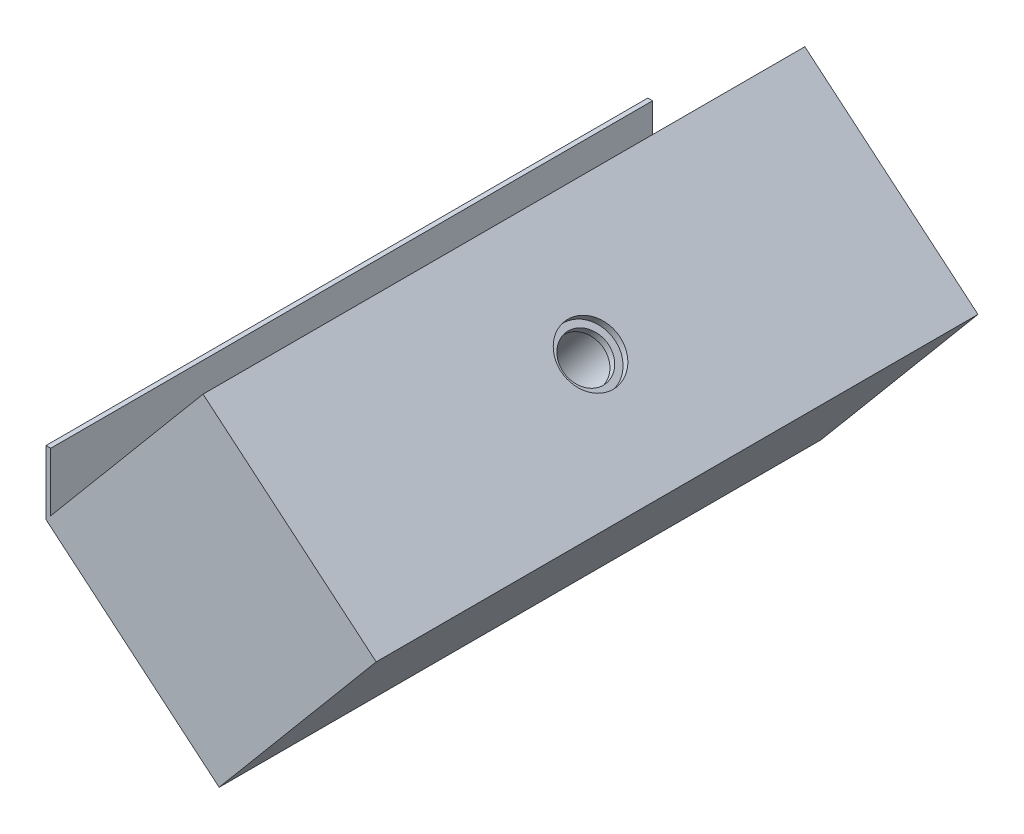
ISO-10303-21;
HEADER;
FILE_DESCRIPTION(('STEP AP214'),'2;1');
FILE_NAME('part.step','',(''),(''),'','','');
FILE_SCHEMA(('AUTOMOTIVE_DESIGN { 1 0 10303 214 1 1 1 1 }'));
ENDSEC;
DATA;
#1=APPLICATION_CONTEXT('core data for automotive mechanical design processes');
#2=APPLICATION_PROTOCOL_DEFINITION('international standard','automotive_design',2000,#1);
#3=PRODUCT_CONTEXT('',#1,'mechanical');
#4=PRODUCT('Part','Part','',(#3));
#5=PRODUCT_RELATED_PRODUCT_CATEGORY('part','',(#4));
#6=PRODUCT_DEFINITION_FORMATION('','',#4);
#7=PRODUCT_DEFINITION_CONTEXT('part definition',#1,'design');
#8=PRODUCT_DEFINITION('design','',#6,#7);
#9=PRODUCT_DEFINITION_SHAPE('','',#8);
#10=(LENGTH_UNIT() NAMED_UNIT(*) SI_UNIT(.MILLI.,.METRE.));
#11=(NAMED_UNIT(*) PLANE_ANGLE_UNIT() SI_UNIT($,.RADIAN.));
#12=(NAMED_UNIT(*) SI_UNIT($,.STERADIAN.) SOLID_ANGLE_UNIT());
#13=UNCERTAINTY_MEASURE_WITH_UNIT(LENGTH_MEASURE(1.E-05),#10,'distance_accuracy_value','');
#14=(GEOMETRIC_REPRESENTATION_CONTEXT(3) GLOBAL_UNCERTAINTY_ASSIGNED_CONTEXT((#13)) GLOBAL_UNIT_ASSIGNED_CONTEXT((#10,
#11,#12)) REPRESENTATION_CONTEXT('',''));
#15=CARTESIAN_POINT('',(0.,0.,0.));
#16=DIRECTION('',(0.,0.,1.));
#17=DIRECTION('',(1.,0.,0.));
#18=AXIS2_PLACEMENT_3D('',#15,#16,#17);
#19=CARTESIAN_POINT('',(0.,0.,262.8));
#20=DIRECTION('',(0.64278760968654,0.766044443118977,0.));
#21=DIRECTION('',(-0.766044443118977,0.64278760968654,0.));
#22=AXIS2_PLACEMENT_3D('',#19,#20,#21);
#23=PLANE('',#22);
#24=DIRECTION('',(0.,0.,-1.));
#25=VECTOR('',#24,1.);
#26=CARTESIAN_POINT('',(0.,0.,262.8));
#27=LINE('',#26,#25);
#28=CARTESIAN_POINT('',(0.,0.,537.8));
#29=VERTEX_POINT('',#28);
#30=CARTESIAN_POINT('',(0.,0.,-275.));
#31=VERTEX_POINT('',#30);
#32=EDGE_CURVE('E11',#29,#31,#27,.T.);
#33=ORIENTED_EDGE('',*,*,#32,.T.);
#34=DIRECTION('',(-0.766044443118977,0.64278760968654,0.));
#35=VECTOR('',#34,1.);
#36=CARTESIAN_POINT('',(233.858047595361,-196.230201485106,-275.));
#37=LINE('',#36,#35);
#38=CARTESIAN_POINT('',(233.858047595361,-196.230201485106,-275.));
#39=VERTEX_POINT('',#38);
#40=EDGE_CURVE('E151',#39,#31,#37,.T.);
#41=ORIENTED_EDGE('',*,*,#40,.F.);
#42=DIRECTION('',(0.,0.,-1.));
#43=VECTOR('',#42,1.);
#44=CARTESIAN_POINT('',(233.858047595361,-196.230201485106,262.8));
#45=LINE('',#44,#43);
#46=CARTESIAN_POINT('',(233.858047595361,-196.230201485106,537.8));
#47=VERTEX_POINT('',#46);
#48=EDGE_CURVE('E49',#47,#39,#45,.T.);
#49=ORIENTED_EDGE('',*,*,#48,.F.);
#50=DIRECTION('',(0.766044443118977,-0.64278760968654,0.));
#51=VECTOR('',#50,1.);
#52=CARTESIAN_POINT('',(233.858047595361,-196.230201485106,537.8));
#53=LINE('',#52,#51);
#54=EDGE_CURVE('E105',#29,#47,#53,.T.);
#55=ORIENTED_EDGE('',*,*,#54,.F.);
#56=EDGE_LOOP('',(#33,#41,#49,#55));
#57=FACE_BOUND('',#56,.T.);
#58=CARTESIAN_POINT('',(116.92902379768,-98.1151007425531,131.4));
#59=DIRECTION('',(0.64278760968654,0.766044443118977,0.));
#60=DIRECTION('',(-0.766044443118977,0.64278760968654,0.));
#61=AXIS2_PLACEMENT_3D('',#58,#59,#60);
#62=CIRCLE('',#61,36.);
#63=CARTESIAN_POINT('',(89.3514238453971,-74.9747467938377,131.4));
#64=VERTEX_POINT('',#63);
#65=EDGE_CURVE('E187',#64,#64,#62,.T.);
#66=ORIENTED_EDGE('',*,*,#65,.T.);
#67=EDGE_LOOP('',(#66));
#68=FACE_BOUND('',#67,.T.);
#69=CARTESIAN_POINT('',(189.601778735524,-159.094782607535,131.291749378634));
#70=DIRECTION('',(-0.642787609686541,-0.766044443118977,0.));
#71=DIRECTION('',(0.766044443118977,-0.64278760968654,0.));
#72=AXIS2_PLACEMENT_3D('',#69,#70,#71);
#73=CIRCLE('',#72,20.52);
#74=CARTESIAN_POINT('',(205.321010708326,-172.284784358303,131.291749378634));
#75=VERTEX_POINT('',#74);
#76=EDGE_CURVE('E354',#75,#75,#73,.F.);
#77=ORIENTED_EDGE('',*,*,#76,.T.);
#78=EDGE_LOOP('',(#77));
#79=FACE_BOUND('',#78,.T.);
#80=CARTESIAN_POINT('',(44.1240820011909,-37.0245009332355,131.291749378634));
#81=DIRECTION('',(-0.642787609686541,-0.766044443118977,0.));
#82=DIRECTION('',(0.766044443118977,-0.64278760968654,0.));
#83=AXIS2_PLACEMENT_3D('',#80,#81,#82);
#84=CIRCLE('',#83,20.52);
#85=CARTESIAN_POINT('',(59.8433139739923,-50.2145026840033,131.291749378634));
#86=VERTEX_POINT('',#85);
#87=EDGE_CURVE('E342',#86,#86,#84,.T.);
#88=ORIENTED_EDGE('',*,*,#87,.F.);
#89=EDGE_LOOP('',(#88));
#90=FACE_BOUND('',#89,.T.);
#91=ADVANCED_FACE('F40',(#57,#68,#79,#90),#23,.F.);
#92=CARTESIAN_POINT('',(205.692035099693,245.134221798073,0.));
#93=DIRECTION('',(-0.64278760968654,-0.766044443118977,0.));
#94=DIRECTION('',(0.766044443118977,-0.64278760968654,0.));
#95=AXIS2_PLACEMENT_3D('',#92,#93,#94);
#96=PLANE('',#95);
#97=CARTESIAN_POINT('',(322.621058897373,147.01912105552,131.4));
#98=DIRECTION('',(0.64278760968654,0.766044443118977,0.));
#99=DIRECTION('',(-0.766044443118977,0.64278760968654,0.));
#100=AXIS2_PLACEMENT_3D('',#97,#98,#99);
#101=CIRCLE('',#100,31.);
#102=CARTESIAN_POINT('',(298.873681160685,166.945536955802,131.4));
#103=VERTEX_POINT('',#102);
#104=EDGE_CURVE('E140',#103,#103,#101,.T.);
#105=ORIENTED_EDGE('',*,*,#104,.F.);
#106=EDGE_LOOP('',(#105));
#107=FACE_BOUND('',#106,.T.);
#108=CARTESIAN_POINT('',(322.621058897373,147.01912105552,131.4));
#109=DIRECTION('',(0.64278760968654,0.766044443118977,0.));
#110=DIRECTION('',(-0.766044443118977,0.642787609686541,0.));
#111=AXIS2_PLACEMENT_3D('',#108,#109,#110);
#112=CIRCLE('',#111,40.);
#113=CARTESIAN_POINT('',(353.262836622132,121.307616668058,131.4));
#114=VERTEX_POINT('',#113);
#115=EDGE_CURVE('E131',#114,#114,#112,.T.);
#116=ORIENTED_EDGE('',*,*,#115,.T.);
#117=EDGE_LOOP('',(#116));
#118=FACE_BOUND('',#117,.T.);
#119=ADVANCED_FACE('F223',(#107,#118),#96,.F.);
#120=CARTESIAN_POINT('',(0.,0.,262.8));
#121=DIRECTION('',(-1.,0.,0.));
#122=DIRECTION('',(0.,0.,1.));
#123=AXIS2_PLACEMENT_3D('',#120,#121,#122);
#124=PLANE('',#123);
#125=DIRECTION('',(0.,0.,-1.));
#126=VECTOR('',#125,1.);
#127=CARTESIAN_POINT('',(0.,86.6680714764509,262.8));
#128=LINE('',#127,#126);
#129=CARTESIAN_POINT('',(0.,86.6680714764509,537.8));
#130=VERTEX_POINT('',#129);
#131=CARTESIAN_POINT('',(0.,86.6680714764509,-275.));
#132=VERTEX_POINT('',#131);
#133=EDGE_CURVE('E191',#130,#132,#128,.T.);
#134=ORIENTED_EDGE('',*,*,#133,.T.);
#135=DIRECTION('',(0.,1.,0.));
#136=VECTOR('',#135,1.);
#137=CARTESIAN_POINT('',(0.,0.,-275.));
#138=LINE('',#137,#136);
#139=EDGE_CURVE('E155',#31,#132,#138,.T.);
#140=ORIENTED_EDGE('',*,*,#139,.F.);
#141=ORIENTED_EDGE('',*,*,#32,.F.);
#142=DIRECTION('',(0.,-1.,0.));
#143=VECTOR('',#142,1.);
#144=CARTESIAN_POINT('',(0.,0.,537.8));
#145=LINE('',#144,#143);
#146=EDGE_CURVE('E182',#130,#29,#145,.T.);
#147=ORIENTED_EDGE('',*,*,#146,.F.);
#148=EDGE_LOOP('',(#134,#140,#141,#147));
#149=FACE_BOUND('',#148,.T.);
#150=ADVANCED_FACE('F42',(#149),#124,.T.);
#151=CARTESIAN_POINT('',(233.858047595361,-196.230201485106,262.8));
#152=DIRECTION('',(0.766044443118977,-0.64278760968654,0.));
#153=DIRECTION('',(0.64278760968654,0.766044443118977,0.));
#154=AXIS2_PLACEMENT_3D('',#151,#152,#153);
#155=PLANE('',#154);
#156=ORIENTED_EDGE('',*,*,#48,.T.);
#157=DIRECTION('',(-0.64278760968654,-0.766044443118977,0.));
#158=VECTOR('',#157,1.);
#159=CARTESIAN_POINT('',(433.122206598188,41.2435758817765,-275.));
#160=LINE('',#159,#158);
#161=CARTESIAN_POINT('',(445.977958791919,56.5644647441563,-275.));
#162=VERTEX_POINT('',#161);
#163=EDGE_CURVE('E109',#162,#39,#160,.T.);
#164=ORIENTED_EDGE('',*,*,#163,.F.);
#165=DIRECTION('',(0.,0.,-1.));
#166=VECTOR('',#165,1.);
#167=CARTESIAN_POINT('',(445.977958791919,56.5644647441563,-275.));
#168=LINE('',#167,#166);
#169=CARTESIAN_POINT('',(445.977958791919,56.5644647441563,537.8));
#170=VERTEX_POINT('',#169);
#171=EDGE_CURVE('E112',#170,#162,#168,.T.);
#172=ORIENTED_EDGE('',*,*,#171,.F.);
#173=DIRECTION('',(0.64278760968654,0.766044443118977,0.));
#174=VECTOR('',#173,1.);
#175=CARTESIAN_POINT('',(433.122206598188,41.2435758817765,537.8));
#176=LINE('',#175,#174);
#177=EDGE_CURVE('E99',#47,#170,#176,.T.);
#178=ORIENTED_EDGE('',*,*,#177,.F.);
#179=EDGE_LOOP('',(#156,#164,#172,#178));
#180=FACE_BOUND('',#179,.T.);
#181=ADVANCED_FACE('F113',(#180),#155,.T.);
#182=CARTESIAN_POINT('',(0.,0.,262.8));
#183=DIRECTION('',(-0.766044443118979,0.642787609686538,0.));
#184=DIRECTION('',(-0.642787609686538,-0.766044443118979,0.));
#185=AXIS2_PLACEMENT_3D('',#182,#183,#184);
#186=PLANE('',#185);
#187=DIRECTION('',(-0.642787609686538,-0.766044443118979,0.));
#188=VECTOR('',#187,1.);
#189=CARTESIAN_POINT('',(6.39354625645953,7.61953172055291,537.8));
#190=LINE('',#189,#188);
#191=CARTESIAN_POINT('',(212.119911196558,252.794666229263,537.8));
#192=VERTEX_POINT('',#191);
#193=CARTESIAN_POINT('',(6.39354625645953,7.61953172055291,537.8));
#194=VERTEX_POINT('',#193);
#195=EDGE_CURVE('E108',#192,#194,#190,.T.);
#196=ORIENTED_EDGE('',*,*,#195,.F.);
#197=DIRECTION('',(0.,0.,1.));
#198=VECTOR('',#197,1.);
#199=CARTESIAN_POINT('',(212.119911196558,252.794666229263,537.8));
#200=LINE('',#199,#198);
#201=CARTESIAN_POINT('',(212.119911196558,252.794666229263,-275.));
#202=VERTEX_POINT('',#201);
#203=EDGE_CURVE('E125',#202,#192,#200,.T.);
#204=ORIENTED_EDGE('',*,*,#203,.F.);
#205=DIRECTION('',(0.642787609686538,0.766044443118979,0.));
#206=VECTOR('',#205,1.);
#207=CARTESIAN_POINT('',(6.39354625645953,7.61953172055291,-275.));
#208=LINE('',#207,#206);
#209=CARTESIAN_POINT('',(6.39354625645953,7.61953172055291,-275.));
#210=VERTEX_POINT('',#209);
#211=EDGE_CURVE('E167',#210,#202,#208,.T.);
#212=ORIENTED_EDGE('',*,*,#211,.F.);
#213=DIRECTION('',(0.,0.,-1.));
#214=VECTOR('',#213,1.);
#215=CARTESIAN_POINT('',(6.39354625645953,7.61953172055291,262.8));
#216=LINE('',#215,#214);
#217=EDGE_CURVE('E197',#194,#210,#216,.T.);
#218=ORIENTED_EDGE('',*,*,#217,.F.);
#219=EDGE_LOOP('',(#196,#204,#212,#218));
#220=FACE_BOUND('',#219,.T.);
#221=ADVANCED_FACE('F212',(#220),#186,.T.);
#222=CARTESIAN_POINT('',(6.39354625645953,0.,262.8));
#223=DIRECTION('',(1.,0.,0.));
#224=DIRECTION('',(0.,1.,0.));
#225=AXIS2_PLACEMENT_3D('',#222,#223,#224);
#226=PLANE('',#225);
#227=ORIENTED_EDGE('',*,*,#217,.T.);
#228=DIRECTION('',(0.,-1.,0.));
#229=VECTOR('',#228,1.);
#230=CARTESIAN_POINT('',(6.39354625645954,86.6680714764509,-275.));
#231=LINE('',#230,#229);
#232=CARTESIAN_POINT('',(6.39354625645954,86.6680714764509,-275.));
#233=VERTEX_POINT('',#232);
#234=EDGE_CURVE('E163',#233,#210,#231,.T.);
#235=ORIENTED_EDGE('',*,*,#234,.F.);
#236=DIRECTION('',(0.,0.,-1.));
#237=VECTOR('',#236,1.);
#238=CARTESIAN_POINT('',(6.39354625645954,86.6680714764509,262.8));
#239=LINE('',#238,#237);
#240=CARTESIAN_POINT('',(6.39354625645954,86.6680714764509,537.8));
#241=VERTEX_POINT('',#240);
#242=EDGE_CURVE('E194',#241,#233,#239,.T.);
#243=ORIENTED_EDGE('',*,*,#242,.F.);
#244=DIRECTION('',(0.,1.,0.));
#245=VECTOR('',#244,1.);
#246=CARTESIAN_POINT('',(6.39354625645954,86.6680714764509,537.8));
#247=LINE('',#246,#245);
#248=EDGE_CURVE('E174',#194,#241,#247,.T.);
#249=ORIENTED_EDGE('',*,*,#248,.F.);
#250=EDGE_LOOP('',(#227,#235,#243,#249));
#251=FACE_BOUND('',#250,.T.);
#252=ADVANCED_FACE('F210',(#251),#226,.T.);
#253=CARTESIAN_POINT('',(0.,86.6680714764509,262.8));
#254=DIRECTION('',(0.,1.,0.));
#255=DIRECTION('',(0.,0.,1.));
#256=AXIS2_PLACEMENT_3D('',#253,#254,#255);
#257=PLANE('',#256);
#258=ORIENTED_EDGE('',*,*,#242,.T.);
#259=DIRECTION('',(1.,0.,0.));
#260=VECTOR('',#259,1.);
#261=CARTESIAN_POINT('',(0.,86.6680714764509,-275.));
#262=LINE('',#261,#260);
#263=EDGE_CURVE('E159',#132,#233,#262,.T.);
#264=ORIENTED_EDGE('',*,*,#263,.F.);
#265=ORIENTED_EDGE('',*,*,#133,.F.);
#266=DIRECTION('',(-1.,0.,0.));
#267=VECTOR('',#266,1.);
#268=CARTESIAN_POINT('',(0.,86.6680714764509,537.8));
#269=LINE('',#268,#267);
#270=EDGE_CURVE('E178',#241,#130,#269,.T.);
#271=ORIENTED_EDGE('',*,*,#270,.F.);
#272=EDGE_LOOP('',(#258,#264,#265,#271));
#273=FACE_BOUND('',#272,.T.);
#274=ADVANCED_FACE('F206',(#273),#257,.T.);
#275=CARTESIAN_POINT('',(412.817694699348,254.511285812435,131.4));
#276=DIRECTION('',(-0.642787609686541,-0.766044443118977,0.));
#277=DIRECTION('',(0.766044443118977,-0.642787609686541,0.));
#278=AXIS2_PLACEMENT_3D('',#275,#276,#277);
#279=CYLINDRICAL_SURFACE('',#278,36.);
#280=CARTESIAN_POINT('',(316.193182800508,139.35867662433,131.4));
#281=DIRECTION('',(-0.64278760968654,-0.766044443118977,0.));
#282=DIRECTION('',(0.766044443118977,-0.64278760968654,0.));
#283=AXIS2_PLACEMENT_3D('',#280,#281,#282);
#284=CIRCLE('',#283,36.);
#285=CARTESIAN_POINT('',(343.770782752791,116.218322675614,131.4));
#286=VERTEX_POINT('',#285);
#287=EDGE_CURVE('E144',#286,#286,#284,.F.);
#288=ORIENTED_EDGE('',*,*,#287,.T.);
#289=EDGE_LOOP('',(#288));
#290=FACE_BOUND('',#289,.T.);
#291=ORIENTED_EDGE('',*,*,#65,.F.);
#292=EDGE_LOOP('',(#291));
#293=FACE_BOUND('',#292,.T.);
#294=ADVANCED_FACE('F249',(#290,#293),#279,.F.);
#295=CARTESIAN_POINT('',(0.,0.,537.8));
#296=DIRECTION('',(0.,0.,-1.));
#297=DIRECTION('',(-1.,0.,0.));
#298=AXIS2_PLACEMENT_3D('',#295,#296,#297);
#299=PLANE('',#298);
#300=ORIENTED_EDGE('',*,*,#177,.T.);
#301=DIRECTION('',(0.766044443118977,-0.64278760968654,0.));
#302=VECTOR('',#301,1.);
#303=CARTESIAN_POINT('',(445.977958791919,56.5644647441563,537.8));
#304=LINE('',#303,#302);
#305=EDGE_CURVE('E104',#192,#170,#304,.T.);
#306=ORIENTED_EDGE('',*,*,#305,.F.);
#307=ORIENTED_EDGE('',*,*,#195,.T.);
#308=ORIENTED_EDGE('',*,*,#248,.T.);
#309=ORIENTED_EDGE('',*,*,#270,.T.);
#310=ORIENTED_EDGE('',*,*,#146,.T.);
#311=ORIENTED_EDGE('',*,*,#54,.T.);
#312=EDGE_LOOP('',(#300,#306,#307,#308,#309,#310,#311));
#313=FACE_BOUND('',#312,.T.);
#314=ADVANCED_FACE('F101',(#313),#299,.F.);
#315=CARTESIAN_POINT('',(0.,0.,-275.));
#316=DIRECTION('',(0.,0.,-1.));
#317=DIRECTION('',(-1.,0.,0.));
#318=AXIS2_PLACEMENT_3D('',#315,#316,#317);
#319=PLANE('',#318);
#320=ORIENTED_EDGE('',*,*,#40,.T.);
#321=ORIENTED_EDGE('',*,*,#139,.T.);
#322=ORIENTED_EDGE('',*,*,#263,.T.);
#323=ORIENTED_EDGE('',*,*,#234,.T.);
#324=ORIENTED_EDGE('',*,*,#211,.T.);
#325=DIRECTION('',(-0.766044443118977,0.64278760968654,0.));
#326=VECTOR('',#325,1.);
#327=CARTESIAN_POINT('',(212.119911196558,252.794666229263,-275.));
#328=LINE('',#327,#326);
#329=EDGE_CURVE('E119',#162,#202,#328,.T.);
#330=ORIENTED_EDGE('',*,*,#329,.F.);
#331=ORIENTED_EDGE('',*,*,#163,.T.);
#332=EDGE_LOOP('',(#320,#321,#322,#323,#324,#330,#331));
#333=FACE_BOUND('',#332,.T.);
#334=ADVANCED_FACE('F201',(#333),#319,.T.);
#335=CARTESIAN_POINT('',(199.264159002828,237.473777366883,0.));
#336=DIRECTION('',(-0.64278760968654,-0.766044443118977,0.));
#337=DIRECTION('',(0.766044443118977,-0.64278760968654,0.));
#338=AXIS2_PLACEMENT_3D('',#335,#336,#337);
#339=PLANE('',#338);
#340=CARTESIAN_POINT('',(316.193182800508,139.35867662433,131.4));
#341=DIRECTION('',(0.64278760968654,0.766044443118977,0.));
#342=DIRECTION('',(-0.766044443118977,0.64278760968654,0.));
#343=AXIS2_PLACEMENT_3D('',#340,#341,#342);
#344=CIRCLE('',#343,31.);
#345=CARTESIAN_POINT('',(292.44580506382,159.285092524612,131.4));
#346=VERTEX_POINT('',#345);
#347=EDGE_CURVE('E139',#346,#346,#344,.T.);
#348=ORIENTED_EDGE('',*,*,#347,.T.);
#349=EDGE_LOOP('',(#348));
#350=FACE_BOUND('',#349,.T.);
#351=ORIENTED_EDGE('',*,*,#287,.F.);
#352=EDGE_LOOP('',(#351));
#353=FACE_BOUND('',#352,.T.);
#354=ADVANCED_FACE('F241',(#350,#353),#339,.T.);
#355=CARTESIAN_POINT('',(322.621058897373,147.01912105552,131.4));
#356=DIRECTION('',(-0.64278760968654,-0.766044443118977,0.));
#357=DIRECTION('',(0.766044443118977,-0.64278760968654,0.));
#358=AXIS2_PLACEMENT_3D('',#355,#356,#357);
#359=CYLINDRICAL_SURFACE('',#358,31.);
#360=ORIENTED_EDGE('',*,*,#104,.T.);
#361=EDGE_LOOP('',(#360));
#362=FACE_BOUND('',#361,.T.);
#363=ORIENTED_EDGE('',*,*,#347,.F.);
#364=EDGE_LOOP('',(#363));
#365=FACE_BOUND('',#364,.T.);
#366=ADVANCED_FACE('F239',(#362,#365),#359,.F.);
#367=CARTESIAN_POINT('',(212.119911196559,252.794666229263,0.));
#368=DIRECTION('',(-0.64278760968654,-0.766044443118977,0.));
#369=DIRECTION('',(0.766044443118977,-0.64278760968654,0.));
#370=AXIS2_PLACEMENT_3D('',#367,#368,#369);
#371=PLANE('',#370);
#372=ORIENTED_EDGE('',*,*,#305,.T.);
#373=ORIENTED_EDGE('',*,*,#171,.T.);
#374=ORIENTED_EDGE('',*,*,#329,.T.);
#375=ORIENTED_EDGE('',*,*,#203,.T.);
#376=EDGE_LOOP('',(#372,#373,#374,#375));
#377=FACE_BOUND('',#376,.T.);
#378=CARTESIAN_POINT('',(329.048934994239,154.679565486709,131.4));
#379=DIRECTION('',(0.64278760968654,0.766044443118977,0.));
#380=DIRECTION('',(-0.766044443118977,0.642787609686541,0.));
#381=AXIS2_PLACEMENT_3D('',#378,#379,#380);
#382=CIRCLE('',#381,40.);
#383=CARTESIAN_POINT('',(359.690712718998,128.968061099248,131.4));
#384=VERTEX_POINT('',#383);
#385=EDGE_CURVE('E127',#384,#384,#382,.T.);
#386=ORIENTED_EDGE('',*,*,#385,.F.);
#387=EDGE_LOOP('',(#386));
#388=FACE_BOUND('',#387,.T.);
#389=ADVANCED_FACE('F122',(#377,#388),#371,.F.);
#390=CARTESIAN_POINT('',(329.048934994239,154.679565486709,131.4));
#391=DIRECTION('',(-0.64278760968654,-0.766044443118977,0.));
#392=DIRECTION('',(0.766044443118977,-0.642787609686541,0.));
#393=AXIS2_PLACEMENT_3D('',#390,#391,#392);
#394=CYLINDRICAL_SURFACE('',#393,40.);
#395=CARTESIAN_POINT('',(359.690712718998,128.968061099248,131.4));
#396=CARTESIAN_POINT('',(359.623755676322,128.88826480309,131.4));
#397=CARTESIAN_POINT('',(359.556798633647,128.808468506931,131.4));
#398=CARTESIAN_POINT('',(359.422884548295,128.648875914615,131.4));
#399=CARTESIAN_POINT('',(359.355927505619,128.569079618457,131.4));
#400=CARTESIAN_POINT('',(359.222013420268,128.40948702614,131.4));
#401=CARTESIAN_POINT('',(359.155056377592,128.329690729982,131.4));
#402=CARTESIAN_POINT('',(359.021142292241,128.170098137666,131.4));
#403=CARTESIAN_POINT('',(358.954185249565,128.090301841507,131.4));
#404=CARTESIAN_POINT('',(358.820271164214,127.930709249191,131.4));
#405=CARTESIAN_POINT('',(358.753314121538,127.850912953033,131.4));
#406=CARTESIAN_POINT('',(358.619400036187,127.691320360716,131.4));
#407=CARTESIAN_POINT('',(358.552442993511,127.611524064558,131.4));
#408=CARTESIAN_POINT('',(358.41852890816,127.451931472242,131.4));
#409=CARTESIAN_POINT('',(358.351571865484,127.372135176083,131.4));
#410=CARTESIAN_POINT('',(358.217657780133,127.212542583767,131.4));
#411=CARTESIAN_POINT('',(358.150700737457,127.132746287609,131.4));
#412=CARTESIAN_POINT('',(358.016786652106,126.973153695292,131.4));
#413=CARTESIAN_POINT('',(357.94982960943,126.893357399134,131.4));
#414=CARTESIAN_POINT('',(357.815915524079,126.733764806818,131.4));
#415=CARTESIAN_POINT('',(357.748958481403,126.653968510659,131.4));
#416=CARTESIAN_POINT('',(357.615044396052,126.494375918343,131.4));
#417=CARTESIAN_POINT('',(357.548087353376,126.414579622185,131.4));
#418=CARTESIAN_POINT('',(357.414173268025,126.254987029868,131.4));
#419=CARTESIAN_POINT('',(357.347216225349,126.17519073371,131.4));
#420=CARTESIAN_POINT('',(357.213302139998,126.015598141394,131.4));
#421=CARTESIAN_POINT('',(357.146345097322,125.935801845235,131.4));
#422=CARTESIAN_POINT('',(357.012431011971,125.776209252919,131.4));
#423=CARTESIAN_POINT('',(356.945473969295,125.696412956761,131.4));
#424=CARTESIAN_POINT('',(356.811559883944,125.536820364444,131.4));
#425=CARTESIAN_POINT('',(356.744602841268,125.457024068286,131.4));
#426=CARTESIAN_POINT('',(356.610688755917,125.297431475969,131.4));
#427=CARTESIAN_POINT('',(356.543731713241,125.217635179811,131.4));
#428=CARTESIAN_POINT('',(356.40981762789,125.058042587495,131.4));
#429=CARTESIAN_POINT('',(356.342860585214,124.978246291337,131.4));
#430=CARTESIAN_POINT('',(356.208946499862,124.81865369902,131.4));
#431=CARTESIAN_POINT('',(356.141989457187,124.738857402862,131.4));
#432=CARTESIAN_POINT('',(356.008075371835,124.579264810545,131.4));
#433=CARTESIAN_POINT('',(355.94111832916,124.499468514387,131.4));
#434=CARTESIAN_POINT('',(355.807204243808,124.339875922071,131.4));
#435=CARTESIAN_POINT('',(355.740247201133,124.260079625913,131.4));
#436=CARTESIAN_POINT('',(355.606333115781,124.100487033596,131.4));
#437=CARTESIAN_POINT('',(355.539376073106,124.020690737438,131.4));
#438=CARTESIAN_POINT('',(355.405461987754,123.861098145121,131.4));
#439=CARTESIAN_POINT('',(355.338504945079,123.781301848963,131.4));
#440=CARTESIAN_POINT('',(355.204590859727,123.621709256647,131.4));
#441=CARTESIAN_POINT('',(355.137633817052,123.541912960488,131.4));
#442=CARTESIAN_POINT('',(355.0037197317,123.382320368172,131.4));
#443=CARTESIAN_POINT('',(354.936762689025,123.302524072014,131.4));
#444=CARTESIAN_POINT('',(354.802848603673,123.142931479697,131.4));
#445=CARTESIAN_POINT('',(354.735891560998,123.063135183539,131.4));
#446=CARTESIAN_POINT('',(354.601977475646,122.903542591223,131.4));
#447=CARTESIAN_POINT('',(354.53502043297,122.823746295064,131.4));
#448=CARTESIAN_POINT('',(354.401106347619,122.664153702748,131.4));
#449=CARTESIAN_POINT('',(354.334149304943,122.58435740659,131.4));
#450=CARTESIAN_POINT('',(354.200235219592,122.424764814273,131.4));
#451=CARTESIAN_POINT('',(354.133278176916,122.344968518115,131.4));
#452=CARTESIAN_POINT('',(353.999364091565,122.185375925799,131.4));
#453=CARTESIAN_POINT('',(353.932407048889,122.10557962964,131.4));
#454=CARTESIAN_POINT('',(353.798492963538,121.945987037324,131.4));
#455=CARTESIAN_POINT('',(353.731535920862,121.866190741166,131.4));
#456=CARTESIAN_POINT('',(353.597621835511,121.706598148849,131.4));
#457=CARTESIAN_POINT('',(353.530664792835,121.626801852691,131.4));
#458=CARTESIAN_POINT('',(353.396750707484,121.467209260375,131.4));
#459=CARTESIAN_POINT('',(353.329793664808,121.387412964216,131.4));
#460=CARTESIAN_POINT('',(353.262836622132,121.307616668058,131.4));
#461=B_SPLINE_CURVE_WITH_KNOTS('',3,(#395,#396,#397,#398,#399,#400,#401,#402,#403,#404,#405,
#406,#407,#408,#409,#410,#411,#412,#413,#414,#415,#416,#417,#418,#419,#420,#421,#422,#423,#424,
#425,#426,#427,#428,#429,#430,#431,#432,#433,#434,#435,#436,#437,#438,#439,#440,#441,#442,#443,
#444,#445,#446,#447,#448,#449,#450,#451,#452,#453,#454,#455,#456,#457,#458,#459,#460),
.UNSPECIFIED.,.F.,.F.,(4,2,2,2,2,2,2,2,2,2,2,2,2,2,2,2,2,2,2,2,2,2,2,2,2,2,2,2,2,2,2,2,4),(0.,
0.312499999999974,0.624999999999969,0.937499999999978,1.24999999999997,1.5625,1.87499999999998,
2.18749999999997,2.5,2.81249999999998,3.12499999999997,3.4375,3.74999999999998,4.06249999999997,
4.375,4.68749999999997,4.99999999999997,5.3125,5.62499999999998,5.93749999999997,
6.24999999999999,6.56249999999998,6.87499999999997,7.18749999999999,7.49999999999998,
7.81249999999997,8.125,8.43749999999999,8.74999999999997,9.06249999999999,9.37499999999998,
9.68749999999997,9.99999999999999),.UNSPECIFIED.);
#462=EDGE_CURVE('BSEAM281',#384,#114,#461,.T.);
#463=ORIENTED_EDGE('',*,*,#385,.T.);
#464=ORIENTED_EDGE('',*,*,#115,.F.);
#465=ORIENTED_EDGE('',*,*,#462,.T.);
#466=ORIENTED_EDGE('',*,*,#462,.F.);
#467=EDGE_LOOP('',(#463,#465,#464,#466));
#468=FACE_BOUND('',#467,.T.);
#469=ADVANCED_FACE('F281',(#468),#394,.F.);
#470=CARTESIAN_POINT('',(298.875672382236,-28.8672272773092,131.291749378634));
#471=DIRECTION('',(-0.642787609686541,-0.766044443118977,0.));
#472=DIRECTION('',(0.766044443118977,-0.642787609686541,0.));
#473=AXIS2_PLACEMENT_3D('',#470,#471,#472);
#474=CYLINDRICAL_SURFACE('',#473,20.52);
#475=CARTESIAN_POINT('',(298.875672382236,-28.8672272773092,131.291749378634));
#476=DIRECTION('',(-0.642787609686541,-0.766044443118977,0.));
#477=DIRECTION('',(0.766044443118977,-0.64278760968654,0.));
#478=AXIS2_PLACEMENT_3D('',#475,#476,#477);
#479=CIRCLE('',#478,20.52);
#480=CARTESIAN_POINT('',(314.594904355038,-42.057229028077,131.291749378634));
#481=VERTEX_POINT('',#480);
#482=EDGE_CURVE('E348',#481,#481,#479,.F.);
#483=ORIENTED_EDGE('',*,*,#482,.T.);
#484=EDGE_LOOP('',(#483));
#485=FACE_BOUND('',#484,.T.);
#486=ORIENTED_EDGE('',*,*,#76,.F.);
#487=EDGE_LOOP('',(#486));
#488=FACE_BOUND('',#487,.T.);
#489=ADVANCED_FACE('F286',(#485,#488),#474,.F.);
#490=CARTESIAN_POINT('',(109.273893646712,130.227555330226,0.));
#491=DIRECTION('',(-0.642787609686541,-0.766044443118977,0.));
#492=DIRECTION('',(0.766044443118977,-0.64278760968654,0.));
#493=AXIS2_PLACEMENT_3D('',#490,#491,#492);
#494=PLANE('',#493);
#495=ORIENTED_EDGE('',*,*,#482,.F.);
#496=EDGE_LOOP('',(#495));
#497=FACE_BOUND('',#496,.T.);
#498=ADVANCED_FACE('F299',(#497),#494,.T.);
#499=CARTESIAN_POINT('',(153.397975647903,93.2030543969906,131.291749378634));
#500=DIRECTION('',(-0.642787609686541,-0.766044443118977,0.));
#501=DIRECTION('',(0.766044443118977,-0.642787609686541,0.));
#502=AXIS2_PLACEMENT_3D('',#499,#500,#501);
#503=CYLINDRICAL_SURFACE('',#502,20.52);
#504=CARTESIAN_POINT('',(153.397975647903,93.2030543969906,131.291749378634));
#505=DIRECTION('',(-0.642787609686541,-0.766044443118977,0.));
#506=DIRECTION('',(0.766044443118977,-0.64278760968654,0.));
#507=AXIS2_PLACEMENT_3D('',#504,#505,#506);
#508=CIRCLE('',#507,20.52);
#509=CARTESIAN_POINT('',(169.117207620704,80.0130526462228,131.291749378634));
#510=VERTEX_POINT('',#509);
#511=EDGE_CURVE('E340',#510,#510,#508,.T.);
#512=ORIENTED_EDGE('',*,*,#511,.F.);
#513=EDGE_LOOP('',(#512));
#514=FACE_BOUND('',#513,.T.);
#515=ORIENTED_EDGE('',*,*,#87,.T.);
#516=EDGE_LOOP('',(#515));
#517=FACE_BOUND('',#516,.T.);
#518=ADVANCED_FACE('F307',(#514,#517),#503,.F.);
#519=CARTESIAN_POINT('',(109.273893646712,130.227555330226,0.));
#520=DIRECTION('',(-0.642787609686541,-0.766044443118977,0.));
#521=DIRECTION('',(0.766044443118977,-0.64278760968654,0.));
#522=AXIS2_PLACEMENT_3D('',#519,#520,#521);
#523=PLANE('',#522);
#524=ORIENTED_EDGE('',*,*,#511,.T.);
#525=EDGE_LOOP('',(#524));
#526=FACE_BOUND('',#525,.T.);
#527=ADVANCED_FACE('F315',(#526),#523,.T.);
#528=CLOSED_SHELL('',(#91,#119,#150,#181,#221,#252,#274,#294,#314,#334,#354,#366,#389,#469,#489,
#498,#518,#527));
#529=MANIFOLD_SOLID_BREP('B2',#528);
#530=ADVANCED_BREP_SHAPE_REPRESENTATION('',(#18,#529),#14);
#531=SHAPE_DEFINITION_REPRESENTATION(#9,#530);
ENDSEC;
END-ISO-10303-21;
